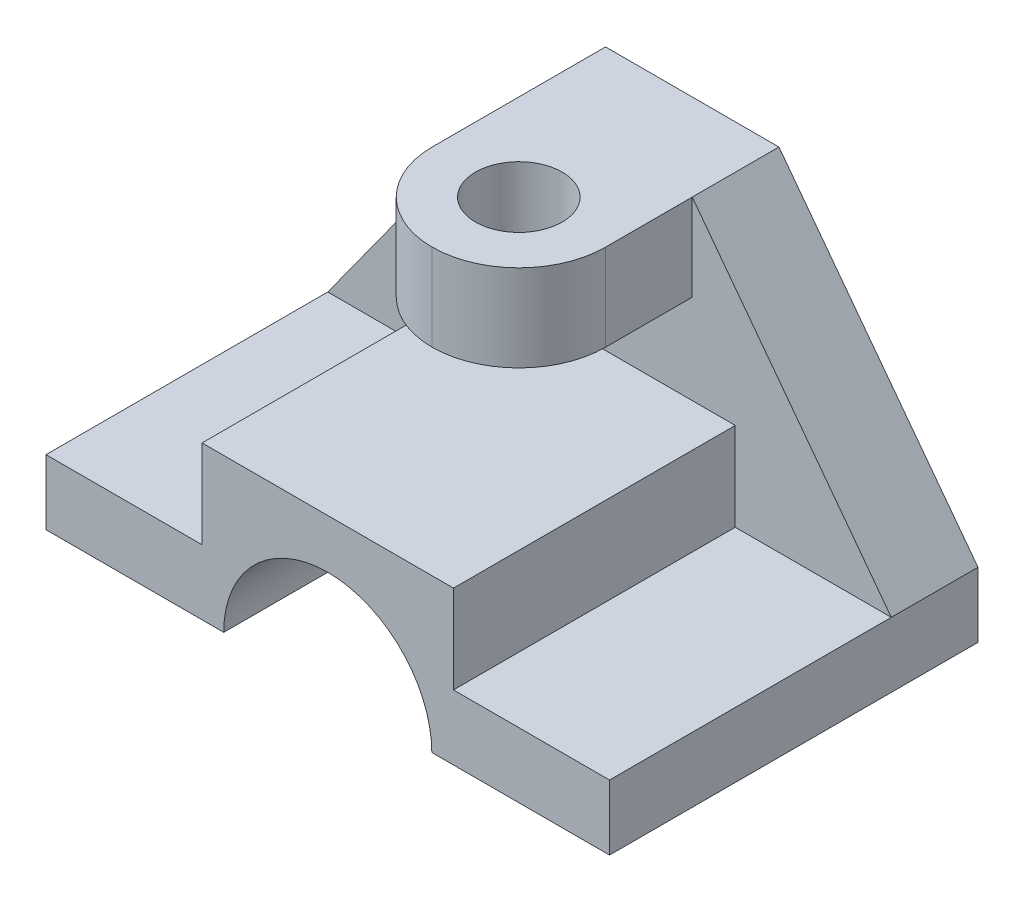
ISO-10303-21;
HEADER;
FILE_DESCRIPTION(('STEP AP214'),'2;1');
FILE_NAME('part.step','',(''),(''),'','','');
FILE_SCHEMA(('AUTOMOTIVE_DESIGN { 1 0 10303 214 1 1 1 1 }'));
ENDSEC;
DATA;
#1=APPLICATION_CONTEXT('core data for automotive mechanical design processes');
#2=APPLICATION_PROTOCOL_DEFINITION('international standard','automotive_design',2000,#1);
#3=PRODUCT_CONTEXT('',#1,'mechanical');
#4=PRODUCT('Part','Part','',(#3));
#5=PRODUCT_RELATED_PRODUCT_CATEGORY('part','',(#4));
#6=PRODUCT_DEFINITION_FORMATION('','',#4);
#7=PRODUCT_DEFINITION_CONTEXT('part definition',#1,'design');
#8=PRODUCT_DEFINITION('design','',#6,#7);
#9=PRODUCT_DEFINITION_SHAPE('','',#8);
#10=(LENGTH_UNIT() NAMED_UNIT(*) SI_UNIT(.MILLI.,.METRE.));
#11=(NAMED_UNIT(*) PLANE_ANGLE_UNIT() SI_UNIT($,.RADIAN.));
#12=(NAMED_UNIT(*) SI_UNIT($,.STERADIAN.) SOLID_ANGLE_UNIT());
#13=UNCERTAINTY_MEASURE_WITH_UNIT(LENGTH_MEASURE(1.E-05),#10,'distance_accuracy_value','');
#14=(GEOMETRIC_REPRESENTATION_CONTEXT(3) GLOBAL_UNCERTAINTY_ASSIGNED_CONTEXT((#13)) GLOBAL_UNIT_ASSIGNED_CONTEXT((#10,
#11,#12)) REPRESENTATION_CONTEXT('',''));
#15=CARTESIAN_POINT('',(0.,0.,0.));
#16=DIRECTION('',(0.,0.,1.));
#17=DIRECTION('',(1.,0.,0.));
#18=AXIS2_PLACEMENT_3D('',#15,#16,#17);
#19=CARTESIAN_POINT('',(0.,0.,20.));
#20=DIRECTION('',(0.,0.,1.));
#21=DIRECTION('',(1.,0.,0.));
#22=AXIS2_PLACEMENT_3D('',#19,#20,#21);
#23=PLANE('',#22);
#24=DIRECTION('',(1.,0.,0.));
#25=VECTOR('',#24,1.);
#26=CARTESIAN_POINT('',(-20.9232479033646,40.8003802281369,20.));
#27=LINE('',#26,#25);
#28=CARTESIAN_POINT('',(-20.9232479033646,40.8003802281369,20.));
#29=VERTEX_POINT('',#28);
#30=CARTESIAN_POINT('',(19.0767520966354,40.8003802281369,20.));
#31=VERTEX_POINT('',#30);
#32=EDGE_CURVE('E161',#29,#31,#27,.T.);
#33=ORIENTED_EDGE('',*,*,#32,.F.);
#34=DIRECTION('',(0.,-1.,0.));
#35=VECTOR('',#34,1.);
#36=CARTESIAN_POINT('',(-20.9232479033646,60.8003802281369,20.));
#37=LINE('',#36,#35);
#38=CARTESIAN_POINT('',(-20.9232479033646,60.8003802281369,20.));
#39=VERTEX_POINT('',#38);
#40=EDGE_CURVE('E173',#39,#29,#37,.T.);
#41=ORIENTED_EDGE('',*,*,#40,.F.);
#42=DIRECTION('',(0.585675640391745,0.810545522627644,0.));
#43=VECTOR('',#42,1.);
#44=CARTESIAN_POINT('',(-65.,-0.199619771863122,20.));
#45=LINE('',#44,#43);
#46=CARTESIAN_POINT('',(-65.,-0.199619771863122,20.));
#47=VERTEX_POINT('',#46);
#48=EDGE_CURVE('E217',#47,#39,#45,.T.);
#49=ORIENTED_EDGE('',*,*,#48,.F.);
#50=DIRECTION('',(-1.,0.,0.));
#51=VECTOR('',#50,1.);
#52=CARTESIAN_POINT('',(-29.,-0.199619771863122,20.));
#53=LINE('',#52,#51);
#54=CARTESIAN_POINT('',(-29.,-0.199619771863122,20.));
#55=VERTEX_POINT('',#54);
#56=EDGE_CURVE('E214',#55,#47,#53,.T.);
#57=ORIENTED_EDGE('',*,*,#56,.F.);
#58=DIRECTION('',(0.,-1.,0.));
#59=VECTOR('',#58,1.);
#60=CARTESIAN_POINT('',(-29.,20.1425855513308,20.));
#61=LINE('',#60,#59);
#62=CARTESIAN_POINT('',(-29.,20.1425855513308,20.));
#63=VERTEX_POINT('',#62);
#64=EDGE_CURVE('E211',#63,#55,#61,.T.);
#65=ORIENTED_EDGE('',*,*,#64,.F.);
#66=DIRECTION('',(-1.,0.,0.));
#67=VECTOR('',#66,1.);
#68=CARTESIAN_POINT('',(29.,20.1425855513308,20.));
#69=LINE('',#68,#67);
#70=CARTESIAN_POINT('',(29.,20.1425855513308,20.));
#71=VERTEX_POINT('',#70);
#72=EDGE_CURVE('E208',#71,#63,#69,.T.);
#73=ORIENTED_EDGE('',*,*,#72,.F.);
#74=DIRECTION('',(0.,1.,0.));
#75=VECTOR('',#74,1.);
#76=CARTESIAN_POINT('',(29.,-0.199619771863115,20.));
#77=LINE('',#76,#75);
#78=CARTESIAN_POINT('',(29.,-0.199619771863115,20.));
#79=VERTEX_POINT('',#78);
#80=EDGE_CURVE('E205',#79,#71,#77,.T.);
#81=ORIENTED_EDGE('',*,*,#80,.F.);
#82=DIRECTION('',(-1.,0.,0.));
#83=VECTOR('',#82,1.);
#84=CARTESIAN_POINT('',(65.,-0.199619771863122,20.));
#85=LINE('',#84,#83);
#86=CARTESIAN_POINT('',(65.,-0.199619771863122,20.));
#87=VERTEX_POINT('',#86);
#88=EDGE_CURVE('E201',#87,#79,#85,.T.);
#89=ORIENTED_EDGE('',*,*,#88,.F.);
#90=DIRECTION('',(0.601451175768195,-0.798909558815675,0.));
#91=VECTOR('',#90,1.);
#92=CARTESIAN_POINT('',(19.0767520966354,60.8003802281369,20.));
#93=LINE('',#92,#91);
#94=CARTESIAN_POINT('',(19.0767520966354,60.8003802281369,20.));
#95=VERTEX_POINT('',#94);
#96=EDGE_CURVE('E197',#95,#87,#93,.T.);
#97=ORIENTED_EDGE('',*,*,#96,.F.);
#98=DIRECTION('',(0.,1.,0.));
#99=VECTOR('',#98,1.);
#100=CARTESIAN_POINT('',(19.0767520966354,60.8003802281369,20.));
#101=LINE('',#100,#99);
#102=EDGE_CURVE('E183',#31,#95,#101,.T.);
#103=ORIENTED_EDGE('',*,*,#102,.F.);
#104=EDGE_LOOP('',(#33,#41,#49,#57,#65,#73,#81,#89,#97,#103));
#105=FACE_BOUND('',#104,.T.);
#106=ADVANCED_FACE('F39',(#105),#23,.T.);
#107=CARTESIAN_POINT('',(0.,-15.1996197718631,85.));
#108=DIRECTION('',(0.,0.,-1.));
#109=DIRECTION('',(-1.,0.,0.));
#110=AXIS2_PLACEMENT_3D('',#107,#108,#109);
#111=CYLINDRICAL_SURFACE('',#110,24.);
#112=CARTESIAN_POINT('',(0.,-15.1996197718631,0.));
#113=DIRECTION('',(0.,0.,-1.));
#114=DIRECTION('',(1.,0.,0.));
#115=AXIS2_PLACEMENT_3D('',#112,#113,#114);
#116=CIRCLE('',#115,24.);
#117=CARTESIAN_POINT('',(-24.,-15.1996197718631,0.));
#118=VERTEX_POINT('',#117);
#119=CARTESIAN_POINT('',(24.,-15.1996197718631,0.));
#120=VERTEX_POINT('',#119);
#121=EDGE_CURVE('E235',#118,#120,#116,.T.);
#122=ORIENTED_EDGE('',*,*,#121,.T.);
#123=DIRECTION('',(0.,0.,-1.));
#124=VECTOR('',#123,1.);
#125=CARTESIAN_POINT('',(24.,-15.1996197718631,85.));
#126=LINE('',#125,#124);
#127=CARTESIAN_POINT('',(24.,-15.1996197718631,85.));
#128=VERTEX_POINT('',#127);
#129=EDGE_CURVE('E327',#128,#120,#126,.T.);
#130=ORIENTED_EDGE('',*,*,#129,.F.);
#131=CARTESIAN_POINT('',(0.,-15.1996197718631,85.));
#132=DIRECTION('',(0.,0.,-1.));
#133=DIRECTION('',(1.,0.,0.));
#134=AXIS2_PLACEMENT_3D('',#131,#132,#133);
#135=CIRCLE('',#134,24.);
#136=CARTESIAN_POINT('',(-24.,-15.1996197718631,85.));
#137=VERTEX_POINT('',#136);
#138=EDGE_CURVE('E245',#137,#128,#135,.T.);
#139=ORIENTED_EDGE('',*,*,#138,.F.);
#140=DIRECTION('',(0.,0.,-1.));
#141=VECTOR('',#140,1.);
#142=CARTESIAN_POINT('',(-24.,-15.1996197718631,85.));
#143=LINE('',#142,#141);
#144=EDGE_CURVE('E277',#137,#118,#143,.T.);
#145=ORIENTED_EDGE('',*,*,#144,.T.);
#146=EDGE_LOOP('',(#122,#130,#139,#145));
#147=FACE_BOUND('',#146,.T.);
#148=ADVANCED_FACE('F401',(#147),#111,.F.);
#149=CARTESIAN_POINT('',(65.,-15.1996197718631,85.));
#150=DIRECTION('',(0.,1.,0.));
#151=DIRECTION('',(-1.,0.,0.));
#152=AXIS2_PLACEMENT_3D('',#149,#150,#151);
#153=PLANE('',#152);
#154=DIRECTION('',(1.,0.,0.));
#155=VECTOR('',#154,1.);
#156=CARTESIAN_POINT('',(65.,-15.1996197718631,0.));
#157=LINE('',#156,#155);
#158=CARTESIAN_POINT('',(65.,-15.1996197718631,0.));
#159=VERTEX_POINT('',#158);
#160=EDGE_CURVE('E281',#120,#159,#157,.T.);
#161=ORIENTED_EDGE('',*,*,#160,.T.);
#162=DIRECTION('',(0.,0.,-1.));
#163=VECTOR('',#162,1.);
#164=CARTESIAN_POINT('',(65.,-15.1996197718631,85.));
#165=LINE('',#164,#163);
#166=CARTESIAN_POINT('',(65.,-15.1996197718631,85.));
#167=VERTEX_POINT('',#166);
#168=EDGE_CURVE('E323',#167,#159,#165,.T.);
#169=ORIENTED_EDGE('',*,*,#168,.F.);
#170=DIRECTION('',(1.,0.,0.));
#171=VECTOR('',#170,1.);
#172=CARTESIAN_POINT('',(65.,-15.1996197718631,85.));
#173=LINE('',#172,#171);
#174=EDGE_CURVE('E249',#128,#167,#173,.T.);
#175=ORIENTED_EDGE('',*,*,#174,.F.);
#176=ORIENTED_EDGE('',*,*,#129,.T.);
#177=EDGE_LOOP('',(#161,#169,#175,#176));
#178=FACE_BOUND('',#177,.T.);
#179=ADVANCED_FACE('F404',(#178),#153,.F.);
#180=CARTESIAN_POINT('',(65.,-0.199619771863122,85.));
#181=DIRECTION('',(-1.,0.,0.));
#182=DIRECTION('',(0.,0.,1.));
#183=AXIS2_PLACEMENT_3D('',#180,#181,#182);
#184=PLANE('',#183);
#185=DIRECTION('',(0.,1.,0.));
#186=VECTOR('',#185,1.);
#187=CARTESIAN_POINT('',(65.,-0.199619771863122,0.));
#188=LINE('',#187,#186);
#189=CARTESIAN_POINT('',(65.,-0.199619771863122,0.));
#190=VERTEX_POINT('',#189);
#191=EDGE_CURVE('E284',#159,#190,#188,.T.);
#192=ORIENTED_EDGE('',*,*,#191,.T.);
#193=DIRECTION('',(0.,0.,-1.));
#194=VECTOR('',#193,1.);
#195=CARTESIAN_POINT('',(65.,-0.199619771863122,20.));
#196=LINE('',#195,#194);
#197=EDGE_CURVE('E221',#87,#190,#196,.T.);
#198=ORIENTED_EDGE('',*,*,#197,.F.);
#199=DIRECTION('',(0.,0.,-1.));
#200=VECTOR('',#199,1.);
#201=CARTESIAN_POINT('',(65.,-0.199619771863122,85.));
#202=LINE('',#201,#200);
#203=CARTESIAN_POINT('',(65.,-0.199619771863122,85.));
#204=VERTEX_POINT('',#203);
#205=EDGE_CURVE('E319',#204,#87,#202,.T.);
#206=ORIENTED_EDGE('',*,*,#205,.F.);
#207=DIRECTION('',(0.,1.,0.));
#208=VECTOR('',#207,1.);
#209=CARTESIAN_POINT('',(65.,-0.199619771863122,85.));
#210=LINE('',#209,#208);
#211=EDGE_CURVE('E253',#167,#204,#210,.T.);
#212=ORIENTED_EDGE('',*,*,#211,.F.);
#213=ORIENTED_EDGE('',*,*,#168,.T.);
#214=EDGE_LOOP('',(#192,#198,#206,#212,#213));
#215=FACE_BOUND('',#214,.T.);
#216=ADVANCED_FACE('F386',(#215),#184,.F.);
#217=CARTESIAN_POINT('',(29.,-0.199619771863115,85.));
#218=DIRECTION('',(0.,-1.,0.));
#219=DIRECTION('',(1.,0.,0.));
#220=AXIS2_PLACEMENT_3D('',#217,#218,#219);
#221=PLANE('',#220);
#222=ORIENTED_EDGE('',*,*,#205,.T.);
#223=ORIENTED_EDGE('',*,*,#88,.T.);
#224=DIRECTION('',(0.,0.,-1.));
#225=VECTOR('',#224,1.);
#226=CARTESIAN_POINT('',(29.,-0.199619771863115,85.));
#227=LINE('',#226,#225);
#228=CARTESIAN_POINT('',(29.,-0.199619771863115,85.));
#229=VERTEX_POINT('',#228);
#230=EDGE_CURVE('E315',#229,#79,#227,.T.);
#231=ORIENTED_EDGE('',*,*,#230,.F.);
#232=DIRECTION('',(-1.,0.,0.));
#233=VECTOR('',#232,1.);
#234=CARTESIAN_POINT('',(29.,-0.199619771863115,85.));
#235=LINE('',#234,#233);
#236=EDGE_CURVE('E256',#204,#229,#235,.T.);
#237=ORIENTED_EDGE('',*,*,#236,.F.);
#238=EDGE_LOOP('',(#222,#223,#231,#237));
#239=FACE_BOUND('',#238,.T.);
#240=ADVANCED_FACE('F382',(#239),#221,.F.);
#241=CARTESIAN_POINT('',(29.,20.1425855513308,85.));
#242=DIRECTION('',(-1.,0.,0.));
#243=DIRECTION('',(0.,-1.,0.));
#244=AXIS2_PLACEMENT_3D('',#241,#242,#243);
#245=PLANE('',#244);
#246=ORIENTED_EDGE('',*,*,#230,.T.);
#247=ORIENTED_EDGE('',*,*,#80,.T.);
#248=DIRECTION('',(0.,0.,-1.));
#249=VECTOR('',#248,1.);
#250=CARTESIAN_POINT('',(29.,20.1425855513308,85.));
#251=LINE('',#250,#249);
#252=CARTESIAN_POINT('',(29.,20.1425855513308,85.));
#253=VERTEX_POINT('',#252);
#254=EDGE_CURVE('E311',#253,#71,#251,.T.);
#255=ORIENTED_EDGE('',*,*,#254,.F.);
#256=DIRECTION('',(0.,1.,0.));
#257=VECTOR('',#256,1.);
#258=CARTESIAN_POINT('',(29.,20.1425855513308,85.));
#259=LINE('',#258,#257);
#260=EDGE_CURVE('E259',#229,#253,#259,.T.);
#261=ORIENTED_EDGE('',*,*,#260,.F.);
#262=EDGE_LOOP('',(#246,#247,#255,#261));
#263=FACE_BOUND('',#262,.T.);
#264=ADVANCED_FACE('F377',(#263),#245,.F.);
#265=CARTESIAN_POINT('',(-29.,20.1425855513308,85.));
#266=DIRECTION('',(0.,-1.,0.));
#267=DIRECTION('',(0.,0.,-1.));
#268=AXIS2_PLACEMENT_3D('',#265,#266,#267);
#269=PLANE('',#268);
#270=ORIENTED_EDGE('',*,*,#254,.T.);
#271=ORIENTED_EDGE('',*,*,#72,.T.);
#272=DIRECTION('',(0.,0.,-1.));
#273=VECTOR('',#272,1.);
#274=CARTESIAN_POINT('',(-29.,20.1425855513308,85.));
#275=LINE('',#274,#273);
#276=CARTESIAN_POINT('',(-29.,20.1425855513308,85.));
#277=VERTEX_POINT('',#276);
#278=EDGE_CURVE('E307',#277,#63,#275,.T.);
#279=ORIENTED_EDGE('',*,*,#278,.F.);
#280=DIRECTION('',(-1.,0.,0.));
#281=VECTOR('',#280,1.);
#282=CARTESIAN_POINT('',(-29.,20.1425855513308,85.));
#283=LINE('',#282,#281);
#284=EDGE_CURVE('E262',#253,#277,#283,.T.);
#285=ORIENTED_EDGE('',*,*,#284,.F.);
#286=EDGE_LOOP('',(#270,#271,#279,#285));
#287=FACE_BOUND('',#286,.T.);
#288=ADVANCED_FACE('F372',(#287),#269,.F.);
#289=CARTESIAN_POINT('',(-29.,-0.199619771863122,85.));
#290=DIRECTION('',(1.,0.,0.));
#291=DIRECTION('',(0.,1.,0.));
#292=AXIS2_PLACEMENT_3D('',#289,#290,#291);
#293=PLANE('',#292);
#294=ORIENTED_EDGE('',*,*,#278,.T.);
#295=ORIENTED_EDGE('',*,*,#64,.T.);
#296=DIRECTION('',(0.,0.,-1.));
#297=VECTOR('',#296,1.);
#298=CARTESIAN_POINT('',(-29.,-0.199619771863122,85.));
#299=LINE('',#298,#297);
#300=CARTESIAN_POINT('',(-29.,-0.199619771863122,85.));
#301=VERTEX_POINT('',#300);
#302=EDGE_CURVE('E303',#301,#55,#299,.T.);
#303=ORIENTED_EDGE('',*,*,#302,.F.);
#304=DIRECTION('',(0.,-1.,0.));
#305=VECTOR('',#304,1.);
#306=CARTESIAN_POINT('',(-29.,-0.199619771863122,85.));
#307=LINE('',#306,#305);
#308=EDGE_CURVE('E265',#277,#301,#307,.T.);
#309=ORIENTED_EDGE('',*,*,#308,.F.);
#310=EDGE_LOOP('',(#294,#295,#303,#309));
#311=FACE_BOUND('',#310,.T.);
#312=ADVANCED_FACE('F370',(#311),#293,.F.);
#313=CARTESIAN_POINT('',(-65.,-0.199619771863122,85.));
#314=DIRECTION('',(0.,-1.,0.));
#315=DIRECTION('',(0.,0.,-1.));
#316=AXIS2_PLACEMENT_3D('',#313,#314,#315);
#317=PLANE('',#316);
#318=ORIENTED_EDGE('',*,*,#302,.T.);
#319=ORIENTED_EDGE('',*,*,#56,.T.);
#320=DIRECTION('',(0.,0.,-1.));
#321=VECTOR('',#320,1.);
#322=CARTESIAN_POINT('',(-65.,-0.199619771863122,85.));
#323=LINE('',#322,#321);
#324=CARTESIAN_POINT('',(-65.,-0.199619771863122,85.));
#325=VERTEX_POINT('',#324);
#326=EDGE_CURVE('E299',#325,#47,#323,.T.);
#327=ORIENTED_EDGE('',*,*,#326,.F.);
#328=DIRECTION('',(-1.,0.,0.));
#329=VECTOR('',#328,1.);
#330=CARTESIAN_POINT('',(-65.,-0.199619771863122,85.));
#331=LINE('',#330,#329);
#332=EDGE_CURVE('E268',#301,#325,#331,.T.);
#333=ORIENTED_EDGE('',*,*,#332,.F.);
#334=EDGE_LOOP('',(#318,#319,#327,#333));
#335=FACE_BOUND('',#334,.T.);
#336=ADVANCED_FACE('F354',(#335),#317,.F.);
#337=CARTESIAN_POINT('',(-65.,-15.1996197718631,85.));
#338=DIRECTION('',(1.,0.,0.));
#339=DIRECTION('',(0.,0.,-1.));
#340=AXIS2_PLACEMENT_3D('',#337,#338,#339);
#341=PLANE('',#340);
#342=DIRECTION('',(0.,-1.,0.));
#343=VECTOR('',#342,1.);
#344=CARTESIAN_POINT('',(-65.,-15.1996197718631,0.));
#345=LINE('',#344,#343);
#346=CARTESIAN_POINT('',(-65.,-0.199619771863122,0.));
#347=VERTEX_POINT('',#346);
#348=CARTESIAN_POINT('',(-65.,-15.1996197718631,0.));
#349=VERTEX_POINT('',#348);
#350=EDGE_CURVE('E287',#347,#349,#345,.T.);
#351=ORIENTED_EDGE('',*,*,#350,.T.);
#352=DIRECTION('',(0.,0.,-1.));
#353=VECTOR('',#352,1.);
#354=CARTESIAN_POINT('',(-65.,-15.1996197718631,85.));
#355=LINE('',#354,#353);
#356=CARTESIAN_POINT('',(-65.,-15.1996197718631,85.));
#357=VERTEX_POINT('',#356);
#358=EDGE_CURVE('E295',#357,#349,#355,.T.);
#359=ORIENTED_EDGE('',*,*,#358,.F.);
#360=DIRECTION('',(0.,-1.,0.));
#361=VECTOR('',#360,1.);
#362=CARTESIAN_POINT('',(-65.,-15.1996197718631,85.));
#363=LINE('',#362,#361);
#364=EDGE_CURVE('E271',#325,#357,#363,.T.);
#365=ORIENTED_EDGE('',*,*,#364,.F.);
#366=ORIENTED_EDGE('',*,*,#326,.T.);
#367=DIRECTION('',(0.,0.,-1.));
#368=VECTOR('',#367,1.);
#369=CARTESIAN_POINT('',(-65.,-0.199619771863122,20.));
#370=LINE('',#369,#368);
#371=EDGE_CURVE('E239',#47,#347,#370,.T.);
#372=ORIENTED_EDGE('',*,*,#371,.T.);
#373=EDGE_LOOP('',(#351,#359,#365,#366,#372));
#374=FACE_BOUND('',#373,.T.);
#375=ADVANCED_FACE('F359',(#374),#341,.F.);
#376=CARTESIAN_POINT('',(-24.,-15.1996197718631,85.));
#377=DIRECTION('',(0.,1.,0.));
#378=DIRECTION('',(-1.,0.,0.));
#379=AXIS2_PLACEMENT_3D('',#376,#377,#378);
#380=PLANE('',#379);
#381=DIRECTION('',(1.,0.,0.));
#382=VECTOR('',#381,1.);
#383=CARTESIAN_POINT('',(-24.,-15.1996197718631,0.));
#384=LINE('',#383,#382);
#385=EDGE_CURVE('E250',#349,#118,#384,.T.);
#386=ORIENTED_EDGE('',*,*,#385,.T.);
#387=ORIENTED_EDGE('',*,*,#144,.F.);
#388=DIRECTION('',(1.,0.,0.));
#389=VECTOR('',#388,1.);
#390=CARTESIAN_POINT('',(-24.,-15.1996197718631,85.));
#391=LINE('',#390,#389);
#392=EDGE_CURVE('E274',#357,#137,#391,.T.);
#393=ORIENTED_EDGE('',*,*,#392,.F.);
#394=ORIENTED_EDGE('',*,*,#358,.T.);
#395=EDGE_LOOP('',(#386,#387,#393,#394));
#396=FACE_BOUND('',#395,.T.);
#397=ADVANCED_FACE('F397',(#396),#380,.F.);
#398=CARTESIAN_POINT('',(0.,-15.1996197718631,85.));
#399=DIRECTION('',(0.,0.,1.));
#400=DIRECTION('',(1.,0.,0.));
#401=AXIS2_PLACEMENT_3D('',#398,#399,#400);
#402=PLANE('',#401);
#403=ORIENTED_EDGE('',*,*,#138,.T.);
#404=ORIENTED_EDGE('',*,*,#174,.T.);
#405=ORIENTED_EDGE('',*,*,#211,.T.);
#406=ORIENTED_EDGE('',*,*,#236,.T.);
#407=ORIENTED_EDGE('',*,*,#260,.T.);
#408=ORIENTED_EDGE('',*,*,#284,.T.);
#409=ORIENTED_EDGE('',*,*,#308,.T.);
#410=ORIENTED_EDGE('',*,*,#332,.T.);
#411=ORIENTED_EDGE('',*,*,#364,.T.);
#412=ORIENTED_EDGE('',*,*,#392,.T.);
#413=EDGE_LOOP('',(#403,#404,#405,#406,#407,#408,#409,#410,#411,#412));
#414=FACE_BOUND('',#413,.T.);
#415=ADVANCED_FACE('F364',(#414),#402,.T.);
#416=CARTESIAN_POINT('',(0.,-15.1996197718631,0.));
#417=DIRECTION('',(0.,0.,1.));
#418=DIRECTION('',(1.,0.,0.));
#419=AXIS2_PLACEMENT_3D('',#416,#417,#418);
#420=PLANE('',#419);
#421=ORIENTED_EDGE('',*,*,#350,.F.);
#422=DIRECTION('',(0.585675640391745,0.810545522627644,0.));
#423=VECTOR('',#422,1.);
#424=CARTESIAN_POINT('',(-65.,-0.199619771863122,0.));
#425=LINE('',#424,#423);
#426=CARTESIAN_POINT('',(-20.9232479033646,60.8003802281369,0.));
#427=VERTEX_POINT('',#426);
#428=EDGE_CURVE('E225',#347,#427,#425,.T.);
#429=ORIENTED_EDGE('',*,*,#428,.T.);
#430=DIRECTION('',(1.,0.,0.));
#431=VECTOR('',#430,1.);
#432=CARTESIAN_POINT('',(-20.9232479033646,60.8003802281369,0.));
#433=LINE('',#432,#431);
#434=CARTESIAN_POINT('',(19.0767520966354,60.8003802281369,0.));
#435=VERTEX_POINT('',#434);
#436=EDGE_CURVE('E202',#427,#435,#433,.T.);
#437=ORIENTED_EDGE('',*,*,#436,.T.);
#438=DIRECTION('',(0.601451175768195,-0.798909558815675,0.));
#439=VECTOR('',#438,1.);
#440=CARTESIAN_POINT('',(19.0767520966354,60.8003802281369,0.));
#441=LINE('',#440,#439);
#442=EDGE_CURVE('E169',#435,#190,#441,.T.);
#443=ORIENTED_EDGE('',*,*,#442,.T.);
#444=ORIENTED_EDGE('',*,*,#191,.F.);
#445=ORIENTED_EDGE('',*,*,#160,.F.);
#446=ORIENTED_EDGE('',*,*,#121,.F.);
#447=ORIENTED_EDGE('',*,*,#385,.F.);
#448=EDGE_LOOP('',(#421,#429,#437,#443,#444,#445,#446,#447));
#449=FACE_BOUND('',#448,.T.);
#450=ADVANCED_FACE('F393',(#449),#420,.F.);
#451=CARTESIAN_POINT('',(19.0767520966354,60.8003802281369,20.));
#452=DIRECTION('',(0.798909558815675,0.601451175768195,0.));
#453=DIRECTION('',(-0.601451175768195,0.798909558815675,0.));
#454=AXIS2_PLACEMENT_3D('',#451,#452,#453);
#455=PLANE('',#454);
#456=ORIENTED_EDGE('',*,*,#442,.F.);
#457=DIRECTION('',(0.,0.,-1.));
#458=VECTOR('',#457,1.);
#459=CARTESIAN_POINT('',(19.0767520966354,60.8003802281369,20.));
#460=LINE('',#459,#458);
#461=EDGE_CURVE('E232',#95,#435,#460,.T.);
#462=ORIENTED_EDGE('',*,*,#461,.F.);
#463=ORIENTED_EDGE('',*,*,#96,.T.);
#464=ORIENTED_EDGE('',*,*,#197,.T.);
#465=EDGE_LOOP('',(#456,#462,#463,#464));
#466=FACE_BOUND('',#465,.T.);
#467=ADVANCED_FACE('F390',(#466),#455,.T.);
#468=CARTESIAN_POINT('',(-20.9232479033646,60.8003802281369,20.));
#469=DIRECTION('',(0.,1.,0.));
#470=DIRECTION('',(-1.,0.,0.));
#471=AXIS2_PLACEMENT_3D('',#468,#469,#470);
#472=PLANE('',#471);
#473=CARTESIAN_POINT('',(-0.923247903364604,60.8003802281369,40.));
#474=DIRECTION('',(0.,1.,0.));
#475=DIRECTION('',(-1.,0.,0.));
#476=AXIS2_PLACEMENT_3D('',#473,#474,#475);
#477=CIRCLE('',#476,10.);
#478=CARTESIAN_POINT('',(-10.9232479033646,60.8003802281369,40.));
#479=VERTEX_POINT('',#478);
#480=EDGE_CURVE('E599',#479,#479,#477,.T.);
#481=ORIENTED_EDGE('',*,*,#480,.F.);
#482=EDGE_LOOP('',(#481));
#483=FACE_BOUND('',#482,.T.);
#484=DIRECTION('',(0.,0.,-1.));
#485=VECTOR('',#484,1.);
#486=CARTESIAN_POINT('',(-20.9232479033646,60.8003802281369,60.));
#487=LINE('',#486,#485);
#488=CARTESIAN_POINT('',(-20.9232479033646,60.8003802281369,40.));
#489=VERTEX_POINT('',#488);
#490=EDGE_CURVE('E175',#489,#39,#487,.T.);
#491=ORIENTED_EDGE('',*,*,#490,.F.);
#492=CARTESIAN_POINT('',(-0.923247903364604,60.8003802281369,40.));
#493=DIRECTION('',(0.,1.,0.));
#494=DIRECTION('',(-1.,0.,0.));
#495=AXIS2_PLACEMENT_3D('',#492,#493,#494);
#496=CIRCLE('',#495,20.);
#497=CARTESIAN_POINT('',(-0.923247903364604,60.8003802281369,60.));
#498=VERTEX_POINT('',#497);
#499=EDGE_CURVE('E49',#489,#498,#496,.T.);
#500=ORIENTED_EDGE('',*,*,#499,.T.);
#501=CARTESIAN_POINT('',(-0.923247903364604,60.8003802281369,40.));
#502=DIRECTION('',(0.,1.,0.));
#503=DIRECTION('',(-1.,0.,0.));
#504=AXIS2_PLACEMENT_3D('',#501,#502,#503);
#505=CIRCLE('',#504,20.);
#506=CARTESIAN_POINT('',(19.0767520966354,60.8003802281369,40.));
#507=VERTEX_POINT('',#506);
#508=EDGE_CURVE('E56',#498,#507,#505,.T.);
#509=ORIENTED_EDGE('',*,*,#508,.T.);
#510=DIRECTION('',(0.,0.,-1.));
#511=VECTOR('',#510,1.);
#512=CARTESIAN_POINT('',(19.0767520966354,60.8003802281369,60.));
#513=LINE('',#512,#511);
#514=EDGE_CURVE('E192',#507,#95,#513,.T.);
#515=ORIENTED_EDGE('',*,*,#514,.T.);
#516=ORIENTED_EDGE('',*,*,#461,.T.);
#517=ORIENTED_EDGE('',*,*,#436,.F.);
#518=DIRECTION('',(0.,0.,-1.));
#519=VECTOR('',#518,1.);
#520=CARTESIAN_POINT('',(-20.9232479033646,60.8003802281369,20.));
#521=LINE('',#520,#519);
#522=EDGE_CURVE('E236',#39,#427,#521,.T.);
#523=ORIENTED_EDGE('',*,*,#522,.F.);
#524=EDGE_LOOP('',(#491,#500,#509,#515,#516,#517,#523));
#525=FACE_BOUND('',#524,.T.);
#526=ADVANCED_FACE('F343',(#483,#525),#472,.T.);
#527=CARTESIAN_POINT('',(-65.,-0.199619771863122,20.));
#528=DIRECTION('',(-0.810545522627644,0.585675640391745,0.));
#529=DIRECTION('',(-0.585675640391745,-0.810545522627644,0.));
#530=AXIS2_PLACEMENT_3D('',#527,#528,#529);
#531=PLANE('',#530);
#532=ORIENTED_EDGE('',*,*,#428,.F.);
#533=ORIENTED_EDGE('',*,*,#371,.F.);
#534=ORIENTED_EDGE('',*,*,#48,.T.);
#535=ORIENTED_EDGE('',*,*,#522,.T.);
#536=EDGE_LOOP('',(#532,#533,#534,#535));
#537=FACE_BOUND('',#536,.T.);
#538=ADVANCED_FACE('F348',(#537),#531,.T.);
#539=CARTESIAN_POINT('',(-20.9232479033646,60.8003802281369,60.));
#540=DIRECTION('',(1.,0.,0.));
#541=DIRECTION('',(0.,1.,0.));
#542=AXIS2_PLACEMENT_3D('',#539,#540,#541);
#543=PLANE('',#542);
#544=DIRECTION('',(0.,0.,-1.));
#545=VECTOR('',#544,1.);
#546=CARTESIAN_POINT('',(-20.9232479033646,40.8003802281369,60.));
#547=LINE('',#546,#545);
#548=CARTESIAN_POINT('',(-20.9232479033646,40.8003802281369,40.));
#549=VERTEX_POINT('',#548);
#550=EDGE_CURVE('E156',#549,#29,#547,.T.);
#551=ORIENTED_EDGE('',*,*,#550,.F.);
#552=DIRECTION('',(0.,-1.,0.));
#553=VECTOR('',#552,1.);
#554=CARTESIAN_POINT('',(-20.9232479033646,60.8003802281369,40.));
#555=LINE('',#554,#553);
#556=EDGE_CURVE('E336',#549,#489,#555,.F.);
#557=ORIENTED_EDGE('',*,*,#556,.T.);
#558=ORIENTED_EDGE('',*,*,#490,.T.);
#559=ORIENTED_EDGE('',*,*,#40,.T.);
#560=EDGE_LOOP('',(#551,#557,#558,#559));
#561=FACE_BOUND('',#560,.T.);
#562=ADVANCED_FACE('F174',(#561),#543,.F.);
#563=CARTESIAN_POINT('',(-20.9232479033646,40.8003802281369,60.));
#564=DIRECTION('',(0.,1.,0.));
#565=DIRECTION('',(0.,0.,1.));
#566=AXIS2_PLACEMENT_3D('',#563,#564,#565);
#567=PLANE('',#566);
#568=CARTESIAN_POINT('',(-0.923247903364607,40.8003802281369,40.));
#569=DIRECTION('',(0.,1.,0.));
#570=DIRECTION('',(-1.,0.,0.));
#571=AXIS2_PLACEMENT_3D('',#568,#569,#570);
#572=CIRCLE('',#571,10.);
#573=CARTESIAN_POINT('',(-10.9232479033646,40.8003802281369,40.));
#574=VERTEX_POINT('',#573);
#575=EDGE_CURVE('E596',#574,#574,#572,.T.);
#576=ORIENTED_EDGE('',*,*,#575,.T.);
#577=EDGE_LOOP('',(#576));
#578=FACE_BOUND('',#577,.T.);
#579=CARTESIAN_POINT('',(-0.923247903364607,40.8003802281369,40.));
#580=DIRECTION('',(0.,1.,0.));
#581=DIRECTION('',(0.,0.,1.));
#582=AXIS2_PLACEMENT_3D('',#579,#580,#581);
#583=CIRCLE('',#582,20.);
#584=CARTESIAN_POINT('',(19.0767520966354,40.8003802281369,40.));
#585=VERTEX_POINT('',#584);
#586=CARTESIAN_POINT('',(-0.923247903364607,40.8003802281369,60.));
#587=VERTEX_POINT('',#586);
#588=EDGE_CURVE('E331',#585,#587,#583,.F.);
#589=ORIENTED_EDGE('',*,*,#588,.T.);
#590=CARTESIAN_POINT('',(-0.9232479033646,40.8003802281369,40.));
#591=DIRECTION('',(0.,1.,0.));
#592=DIRECTION('',(0.,0.,1.));
#593=AXIS2_PLACEMENT_3D('',#590,#591,#592);
#594=CIRCLE('',#593,20.);
#595=EDGE_CURVE('E164',#587,#549,#594,.F.);
#596=ORIENTED_EDGE('',*,*,#595,.T.);
#597=ORIENTED_EDGE('',*,*,#550,.T.);
#598=ORIENTED_EDGE('',*,*,#32,.T.);
#599=DIRECTION('',(0.,0.,-1.));
#600=VECTOR('',#599,1.);
#601=CARTESIAN_POINT('',(19.0767520966354,40.8003802281369,60.));
#602=LINE('',#601,#600);
#603=EDGE_CURVE('E170',#585,#31,#602,.T.);
#604=ORIENTED_EDGE('',*,*,#603,.F.);
#605=EDGE_LOOP('',(#589,#596,#597,#598,#604));
#606=FACE_BOUND('',#605,.T.);
#607=ADVANCED_FACE('F158',(#578,#606),#567,.F.);
#608=CARTESIAN_POINT('',(19.0767520966354,60.8003802281369,60.));
#609=DIRECTION('',(-1.,0.,0.));
#610=DIRECTION('',(0.,-1.,0.));
#611=AXIS2_PLACEMENT_3D('',#608,#609,#610);
#612=PLANE('',#611);
#613=ORIENTED_EDGE('',*,*,#514,.F.);
#614=DIRECTION('',(0.,1.,0.));
#615=VECTOR('',#614,1.);
#616=CARTESIAN_POINT('',(19.0767520966354,40.8003802281369,40.));
#617=LINE('',#616,#615);
#618=EDGE_CURVE('E11',#507,#585,#617,.F.);
#619=ORIENTED_EDGE('',*,*,#618,.T.);
#620=ORIENTED_EDGE('',*,*,#603,.T.);
#621=ORIENTED_EDGE('',*,*,#102,.T.);
#622=EDGE_LOOP('',(#613,#619,#620,#621));
#623=FACE_BOUND('',#622,.T.);
#624=ADVANCED_FACE('F505',(#623),#612,.F.);
#625=CARTESIAN_POINT('',(-0.923247903364614,0.,40.));
#626=DIRECTION('',(0.,-1.,0.));
#627=DIRECTION('',(1.,0.,0.));
#628=AXIS2_PLACEMENT_3D('',#625,#626,#627);
#629=CYLINDRICAL_SURFACE('',#628,20.);
#630=ORIENTED_EDGE('',*,*,#618,.F.);
#631=ORIENTED_EDGE('',*,*,#508,.F.);
#632=DIRECTION('',(0.,1.,0.));
#633=VECTOR('',#632,1.);
#634=CARTESIAN_POINT('',(-0.923247903364604,60.8003802281369,60.));
#635=LINE('',#634,#633);
#636=EDGE_CURVE('E43',#587,#498,#635,.T.);
#637=ORIENTED_EDGE('',*,*,#636,.F.);
#638=ORIENTED_EDGE('',*,*,#588,.F.);
#639=EDGE_LOOP('',(#630,#631,#637,#638));
#640=FACE_BOUND('',#639,.T.);
#641=ADVANCED_FACE('F41',(#640),#629,.T.);
#642=CARTESIAN_POINT('',(-0.923247903364593,0.,40.));
#643=DIRECTION('',(0.,1.,0.));
#644=DIRECTION('',(-1.,0.,0.));
#645=AXIS2_PLACEMENT_3D('',#642,#643,#644);
#646=CYLINDRICAL_SURFACE('',#645,20.);
#647=ORIENTED_EDGE('',*,*,#499,.F.);
#648=ORIENTED_EDGE('',*,*,#556,.F.);
#649=ORIENTED_EDGE('',*,*,#595,.F.);
#650=ORIENTED_EDGE('',*,*,#636,.T.);
#651=EDGE_LOOP('',(#647,#648,#649,#650));
#652=FACE_BOUND('',#651,.T.);
#653=ADVANCED_FACE('F519',(#652),#646,.T.);
#654=CARTESIAN_POINT('',(-0.923247903364607,40.8003802281369,40.));
#655=DIRECTION('',(0.,1.,0.));
#656=DIRECTION('',(-1.,0.,0.));
#657=AXIS2_PLACEMENT_3D('',#654,#655,#656);
#658=CYLINDRICAL_SURFACE('',#657,10.);
#659=ORIENTED_EDGE('',*,*,#575,.F.);
#660=EDGE_LOOP('',(#659));
#661=FACE_BOUND('',#660,.T.);
#662=ORIENTED_EDGE('',*,*,#480,.T.);
#663=EDGE_LOOP('',(#662));
#664=FACE_BOUND('',#663,.T.);
#665=ADVANCED_FACE('F525',(#661,#664),#658,.F.);
#666=CLOSED_SHELL('',(#106,#148,#179,#216,#240,#264,#288,#312,#336,#375,#397,#415,#450,#467,
#526,#538,#562,#607,#624,#641,#653,#665));
#667=MANIFOLD_SOLID_BREP('B2',#666);
#668=ADVANCED_BREP_SHAPE_REPRESENTATION('',(#18,#667),#14);
#669=SHAPE_DEFINITION_REPRESENTATION(#9,#668);
ENDSEC;
END-ISO-10303-21;
